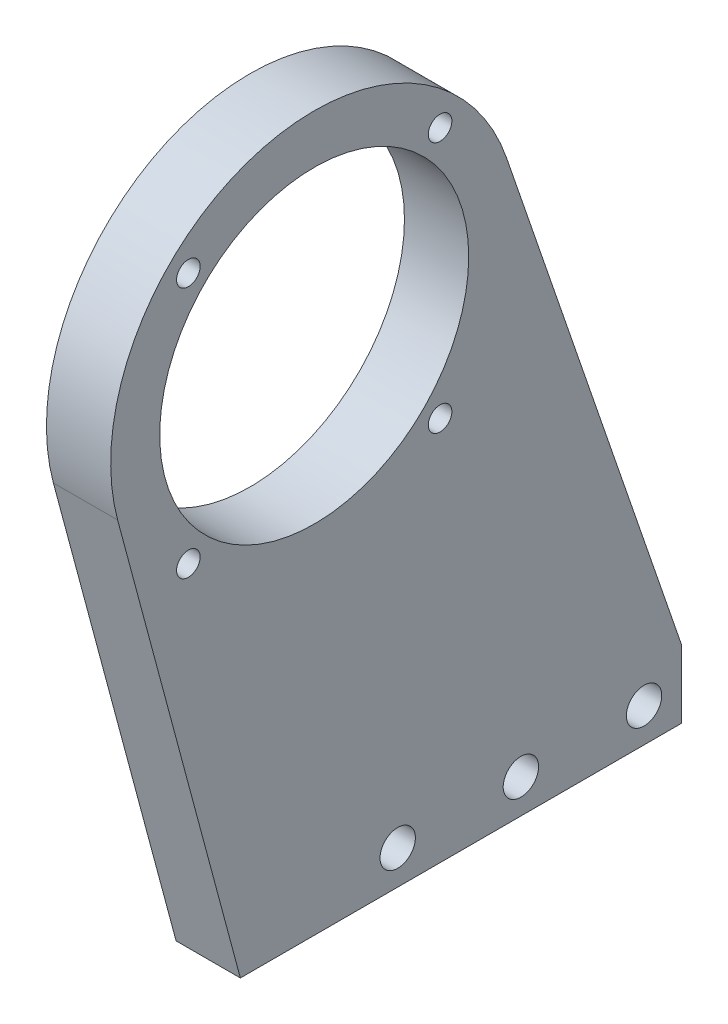
ISO-10303-21;
HEADER;
FILE_DESCRIPTION(('STEP AP214'),'2;1');
FILE_NAME('part.step','',(''),(''),'','','');
FILE_SCHEMA(('AUTOMOTIVE_DESIGN { 1 0 10303 214 1 1 1 1 }'));
ENDSEC;
DATA;
#1=APPLICATION_CONTEXT('core data for automotive mechanical design processes');
#2=APPLICATION_PROTOCOL_DEFINITION('international standard','automotive_design',2000,#1);
#3=PRODUCT_CONTEXT('',#1,'mechanical');
#4=PRODUCT('Part','Part','',(#3));
#5=PRODUCT_RELATED_PRODUCT_CATEGORY('part','',(#4));
#6=PRODUCT_DEFINITION_FORMATION('','',#4);
#7=PRODUCT_DEFINITION_CONTEXT('part definition',#1,'design');
#8=PRODUCT_DEFINITION('design','',#6,#7);
#9=PRODUCT_DEFINITION_SHAPE('','',#8);
#10=(LENGTH_UNIT() NAMED_UNIT(*) SI_UNIT(.MILLI.,.METRE.));
#11=(NAMED_UNIT(*) PLANE_ANGLE_UNIT() SI_UNIT($,.RADIAN.));
#12=(NAMED_UNIT(*) SI_UNIT($,.STERADIAN.) SOLID_ANGLE_UNIT());
#13=UNCERTAINTY_MEASURE_WITH_UNIT(LENGTH_MEASURE(1.E-05),#10,'distance_accuracy_value','');
#14=(GEOMETRIC_REPRESENTATION_CONTEXT(3) GLOBAL_UNCERTAINTY_ASSIGNED_CONTEXT((#13)) GLOBAL_UNIT_ASSIGNED_CONTEXT((#10,
#11,#12)) REPRESENTATION_CONTEXT('',''));
#15=CARTESIAN_POINT('',(0.,0.,0.));
#16=DIRECTION('',(0.,0.,1.));
#17=DIRECTION('',(1.,0.,0.));
#18=AXIS2_PLACEMENT_3D('',#15,#16,#17);
#19=CARTESIAN_POINT('',(12.7,12.3513660545207,-35.9366631253826));
#20=DIRECTION('',(0.,0.325035948803177,-0.945701661194279));
#21=DIRECTION('',(0.,0.945701661194279,0.325035948803177));
#22=AXIS2_PLACEMENT_3D('',#19,#20,#21);
#23=PLANE('',#22);
#24=DIRECTION('',(0.,-0.945701661194279,-0.325035948803178));
#25=VECTOR('',#24,1.);
#26=CARTESIAN_POINT('',(0.,12.3513660545207,-35.9366631253826));
#27=LINE('',#26,#25);
#28=CARTESIAN_POINT('',(0.,12.3513660545207,-35.9366631253826));
#29=VERTEX_POINT('',#28);
#30=CARTESIAN_POINT('',(0.,-82.65,-68.5884606427241));
#31=VERTEX_POINT('',#30);
#32=EDGE_CURVE('E107',#29,#31,#27,.T.);
#33=ORIENTED_EDGE('',*,*,#32,.F.);
#34=DIRECTION('',(-1.,0.,0.));
#35=VECTOR('',#34,1.);
#36=CARTESIAN_POINT('',(12.7,12.3513660545207,-35.9366631253826));
#37=LINE('',#36,#35);
#38=CARTESIAN_POINT('',(12.,12.3513660545207,-35.9366631253826));
#39=VERTEX_POINT('',#38);
#40=EDGE_CURVE('E12',#39,#29,#37,.T.);
#41=ORIENTED_EDGE('',*,*,#40,.F.);
#42=DIRECTION('',(0.,-0.945701661194279,-0.325035948803177));
#43=VECTOR('',#42,1.);
#44=CARTESIAN_POINT('',(12.,12.3513660545207,-35.9366631253826));
#45=LINE('',#44,#43);
#46=CARTESIAN_POINT('',(12.,-82.65,-68.5884606427241));
#47=VERTEX_POINT('',#46);
#48=EDGE_CURVE('E142',#39,#47,#45,.T.);
#49=ORIENTED_EDGE('',*,*,#48,.T.);
#50=DIRECTION('',(-1.,0.,0.));
#51=VECTOR('',#50,1.);
#52=CARTESIAN_POINT('',(12.7,-82.65,-68.5884606427241));
#53=LINE('',#52,#51);
#54=EDGE_CURVE('E63',#47,#31,#53,.T.);
#55=ORIENTED_EDGE('',*,*,#54,.T.);
#56=EDGE_LOOP('',(#33,#41,#49,#55));
#57=FACE_BOUND('',#56,.T.);
#58=ADVANCED_FACE('F44',(#57),#23,.T.);
#59=CARTESIAN_POINT('',(12.7,0.,0.));
#60=DIRECTION('',(-1.,0.,0.));
#61=DIRECTION('',(0.,0.,1.));
#62=AXIS2_PLACEMENT_3D('',#59,#60,#61);
#63=CYLINDRICAL_SURFACE('',#62,38.);
#64=CARTESIAN_POINT('',(0.,0.,0.));
#65=DIRECTION('',(1.,0.,0.));
#66=DIRECTION('',(0.,0.,-1.));
#67=AXIS2_PLACEMENT_3D('',#64,#65,#66);
#68=CIRCLE('',#67,38.);
#69=CARTESIAN_POINT('',(0.,-9.83512371389568,36.7051813989846));
#70=VERTEX_POINT('',#69);
#71=EDGE_CURVE('E100',#29,#70,#68,.T.);
#72=ORIENTED_EDGE('',*,*,#71,.T.);
#73=DIRECTION('',(-1.,0.,0.));
#74=VECTOR('',#73,1.);
#75=CARTESIAN_POINT('',(12.7,-9.83512371389568,36.7051813989846));
#76=LINE('',#75,#74);
#77=CARTESIAN_POINT('',(12.,-9.83512371389568,36.7051813989846));
#78=VERTEX_POINT('',#77);
#79=EDGE_CURVE('E54',#78,#70,#76,.T.);
#80=ORIENTED_EDGE('',*,*,#79,.F.);
#81=CARTESIAN_POINT('',(12.,0.,0.));
#82=DIRECTION('',(1.,0.,0.));
#83=DIRECTION('',(0.,0.,-1.));
#84=AXIS2_PLACEMENT_3D('',#81,#82,#83);
#85=CIRCLE('',#84,38.);
#86=EDGE_CURVE('E78',#39,#78,#85,.T.);
#87=ORIENTED_EDGE('',*,*,#86,.F.);
#88=ORIENTED_EDGE('',*,*,#40,.T.);
#89=EDGE_LOOP('',(#72,#80,#87,#88));
#90=FACE_BOUND('',#89,.T.);
#91=ADVANCED_FACE('F99',(#90),#63,.T.);
#92=CARTESIAN_POINT('',(12.7,-9.8351237138957,36.7051813989846));
#93=DIRECTION('',(0.,0.258819045102518,-0.965925826289069));
#94=DIRECTION('',(0.,0.965925826289069,0.258819045102518));
#95=AXIS2_PLACEMENT_3D('',#92,#93,#94);
#96=PLANE('',#95);
#97=DIRECTION('',(0.,-0.965925826289069,-0.258819045102518));
#98=VECTOR('',#97,1.);
#99=CARTESIAN_POINT('',(0.,-9.8351237138957,36.7051813989846));
#100=LINE('',#99,#98);
#101=CARTESIAN_POINT('',(0.,-95.35,13.7915393572759));
#102=VERTEX_POINT('',#101);
#103=EDGE_CURVE('E109',#70,#102,#100,.T.);
#104=ORIENTED_EDGE('',*,*,#103,.T.);
#105=DIRECTION('',(-1.,0.,0.));
#106=VECTOR('',#105,1.);
#107=CARTESIAN_POINT('',(12.7,-95.35,13.7915393572759));
#108=LINE('',#107,#106);
#109=CARTESIAN_POINT('',(12.,-95.35,13.7915393572759));
#110=VERTEX_POINT('',#109);
#111=EDGE_CURVE('E145',#110,#102,#108,.T.);
#112=ORIENTED_EDGE('',*,*,#111,.F.);
#113=DIRECTION('',(0.,-0.965925826289069,-0.258819045102518));
#114=VECTOR('',#113,1.);
#115=CARTESIAN_POINT('',(12.,-9.8351237138957,36.7051813989846));
#116=LINE('',#115,#114);
#117=EDGE_CURVE('E155',#78,#110,#116,.T.);
#118=ORIENTED_EDGE('',*,*,#117,.F.);
#119=ORIENTED_EDGE('',*,*,#79,.T.);
#120=EDGE_LOOP('',(#104,#112,#118,#119));
#121=FACE_BOUND('',#120,.T.);
#122=ADVANCED_FACE('F197',(#121),#96,.F.);
#123=CARTESIAN_POINT('',(12.7,-95.35,0.));
#124=DIRECTION('',(0.,1.,0.));
#125=DIRECTION('',(0.,0.,1.));
#126=AXIS2_PLACEMENT_3D('',#123,#124,#125);
#127=PLANE('',#126);
#128=DIRECTION('',(0.,0.,-1.));
#129=VECTOR('',#128,1.);
#130=CARTESIAN_POINT('',(0.,-95.35,0.));
#131=LINE('',#130,#129);
#132=CARTESIAN_POINT('',(0.,-95.35,-68.5884606427241));
#133=VERTEX_POINT('',#132);
#134=EDGE_CURVE('E114',#102,#133,#131,.T.);
#135=ORIENTED_EDGE('',*,*,#134,.T.);
#136=DIRECTION('',(-1.,0.,0.));
#137=VECTOR('',#136,1.);
#138=CARTESIAN_POINT('',(12.7,-95.35,-68.5884606427241));
#139=LINE('',#138,#137);
#140=CARTESIAN_POINT('',(12.,-95.35,-68.5884606427241));
#141=VERTEX_POINT('',#140);
#142=EDGE_CURVE('E88',#141,#133,#139,.T.);
#143=ORIENTED_EDGE('',*,*,#142,.F.);
#144=DIRECTION('',(0.,0.,-1.));
#145=VECTOR('',#144,1.);
#146=CARTESIAN_POINT('',(12.,-95.35,0.));
#147=LINE('',#146,#145);
#148=EDGE_CURVE('E153',#110,#141,#147,.T.);
#149=ORIENTED_EDGE('',*,*,#148,.F.);
#150=ORIENTED_EDGE('',*,*,#111,.T.);
#151=EDGE_LOOP('',(#135,#143,#149,#150));
#152=FACE_BOUND('',#151,.T.);
#153=ADVANCED_FACE('F202',(#152),#127,.F.);
#154=CARTESIAN_POINT('',(12.7,-88.9999999999999,-38.59));
#155=DIRECTION('',(-1.,0.,0.));
#156=DIRECTION('',(0.,0.,1.));
#157=AXIS2_PLACEMENT_3D('',#154,#155,#156);
#158=CYLINDRICAL_SURFACE('',#157,3.3);
#159=CARTESIAN_POINT('',(12.,-88.9999999999999,-38.59));
#160=DIRECTION('',(1.,0.,0.));
#161=DIRECTION('',(0.,0.,-1.));
#162=AXIS2_PLACEMENT_3D('',#159,#160,#161);
#163=CIRCLE('',#162,3.3);
#164=CARTESIAN_POINT('',(12.,-88.9999999999999,-41.89));
#165=VERTEX_POINT('',#164);
#166=EDGE_CURVE('E174',#165,#165,#163,.T.);
#167=ORIENTED_EDGE('',*,*,#166,.T.);
#168=EDGE_LOOP('',(#167));
#169=FACE_BOUND('',#168,.T.);
#170=CARTESIAN_POINT('',(0.,-88.9999999999999,-38.59));
#171=DIRECTION('',(1.,0.,0.));
#172=DIRECTION('',(0.,0.,-1.));
#173=AXIS2_PLACEMENT_3D('',#170,#171,#172);
#174=CIRCLE('',#173,3.3);
#175=CARTESIAN_POINT('',(0.,-88.9999999999999,-41.89));
#176=VERTEX_POINT('',#175);
#177=EDGE_CURVE('E136',#176,#176,#174,.T.);
#178=ORIENTED_EDGE('',*,*,#177,.F.);
#179=EDGE_LOOP('',(#178));
#180=FACE_BOUND('',#179,.T.);
#181=ADVANCED_FACE('F206',(#169,#180),#158,.F.);
#182=CARTESIAN_POINT('',(12.7,-88.9999999999999,-15.59));
#183=DIRECTION('',(-1.,0.,0.));
#184=DIRECTION('',(0.,0.,1.));
#185=AXIS2_PLACEMENT_3D('',#182,#183,#184);
#186=CYLINDRICAL_SURFACE('',#185,3.3);
#187=CARTESIAN_POINT('',(12.,-88.9999999999999,-15.59));
#188=DIRECTION('',(1.,0.,0.));
#189=DIRECTION('',(0.,0.,-1.));
#190=AXIS2_PLACEMENT_3D('',#187,#188,#189);
#191=CIRCLE('',#190,3.3);
#192=CARTESIAN_POINT('',(12.,-88.9999999999999,-18.89));
#193=VERTEX_POINT('',#192);
#194=EDGE_CURVE('E172',#193,#193,#191,.T.);
#195=ORIENTED_EDGE('',*,*,#194,.T.);
#196=EDGE_LOOP('',(#195));
#197=FACE_BOUND('',#196,.T.);
#198=CARTESIAN_POINT('',(0.,-88.9999999999999,-15.59));
#199=DIRECTION('',(1.,0.,0.));
#200=DIRECTION('',(0.,0.,-1.));
#201=AXIS2_PLACEMENT_3D('',#198,#199,#200);
#202=CIRCLE('',#201,3.3);
#203=CARTESIAN_POINT('',(0.,-88.9999999999999,-18.89));
#204=VERTEX_POINT('',#203);
#205=EDGE_CURVE('E133',#204,#204,#202,.T.);
#206=ORIENTED_EDGE('',*,*,#205,.F.);
#207=EDGE_LOOP('',(#206));
#208=FACE_BOUND('',#207,.T.);
#209=ADVANCED_FACE('F229',(#197,#208),#186,.F.);
#210=CARTESIAN_POINT('',(12.7,0.,0.));
#211=DIRECTION('',(-1.,0.,0.));
#212=DIRECTION('',(0.,0.,1.));
#213=AXIS2_PLACEMENT_3D('',#210,#211,#212);
#214=CYLINDRICAL_SURFACE('',#213,28.85);
#215=CARTESIAN_POINT('',(12.,0.,0.));
#216=DIRECTION('',(1.,0.,0.));
#217=DIRECTION('',(0.,0.,-1.));
#218=AXIS2_PLACEMENT_3D('',#215,#216,#217);
#219=CIRCLE('',#218,28.85);
#220=CARTESIAN_POINT('',(12.,0.,-28.85));
#221=VERTEX_POINT('',#220);
#222=EDGE_CURVE('E169',#221,#221,#219,.T.);
#223=ORIENTED_EDGE('',*,*,#222,.T.);
#224=EDGE_LOOP('',(#223));
#225=FACE_BOUND('',#224,.T.);
#226=CARTESIAN_POINT('',(0.,0.,0.));
#227=DIRECTION('',(1.,0.,0.));
#228=DIRECTION('',(0.,0.,-1.));
#229=AXIS2_PLACEMENT_3D('',#226,#227,#228);
#230=CIRCLE('',#229,28.85);
#231=CARTESIAN_POINT('',(0.,0.,-28.85));
#232=VERTEX_POINT('',#231);
#233=EDGE_CURVE('E130',#232,#232,#230,.T.);
#234=ORIENTED_EDGE('',*,*,#233,.F.);
#235=EDGE_LOOP('',(#234));
#236=FACE_BOUND('',#235,.T.);
#237=ADVANCED_FACE('F225',(#225,#236),#214,.F.);
#238=CARTESIAN_POINT('',(12.7,23.5,23.5));
#239=DIRECTION('',(-1.,0.,0.));
#240=DIRECTION('',(0.,0.,1.));
#241=AXIS2_PLACEMENT_3D('',#238,#239,#240);
#242=CYLINDRICAL_SURFACE('',#241,2.2);
#243=CARTESIAN_POINT('',(12.,23.5,23.5));
#244=DIRECTION('',(1.,0.,0.));
#245=DIRECTION('',(0.,0.,-1.));
#246=AXIS2_PLACEMENT_3D('',#243,#244,#245);
#247=CIRCLE('',#246,2.2);
#248=CARTESIAN_POINT('',(12.,23.5,21.3));
#249=VERTEX_POINT('',#248);
#250=EDGE_CURVE('E166',#249,#249,#247,.T.);
#251=ORIENTED_EDGE('',*,*,#250,.T.);
#252=EDGE_LOOP('',(#251));
#253=FACE_BOUND('',#252,.T.);
#254=CARTESIAN_POINT('',(0.,23.5,23.5));
#255=DIRECTION('',(1.,0.,0.));
#256=DIRECTION('',(0.,0.,-1.));
#257=AXIS2_PLACEMENT_3D('',#254,#255,#256);
#258=CIRCLE('',#257,2.2);
#259=CARTESIAN_POINT('',(0.,23.5,21.3));
#260=VERTEX_POINT('',#259);
#261=EDGE_CURVE('E127',#260,#260,#258,.T.);
#262=ORIENTED_EDGE('',*,*,#261,.F.);
#263=EDGE_LOOP('',(#262));
#264=FACE_BOUND('',#263,.T.);
#265=ADVANCED_FACE('F221',(#253,#264),#242,.F.);
#266=CARTESIAN_POINT('',(12.7,23.5,-23.5));
#267=DIRECTION('',(-1.,0.,0.));
#268=DIRECTION('',(0.,0.,1.));
#269=AXIS2_PLACEMENT_3D('',#266,#267,#268);
#270=CYLINDRICAL_SURFACE('',#269,2.2);
#271=CARTESIAN_POINT('',(12.,23.5,-23.5));
#272=DIRECTION('',(1.,0.,0.));
#273=DIRECTION('',(0.,0.,-1.));
#274=AXIS2_PLACEMENT_3D('',#271,#272,#273);
#275=CIRCLE('',#274,2.2);
#276=CARTESIAN_POINT('',(12.,23.5,-25.7));
#277=VERTEX_POINT('',#276);
#278=EDGE_CURVE('E163',#277,#277,#275,.T.);
#279=ORIENTED_EDGE('',*,*,#278,.T.);
#280=EDGE_LOOP('',(#279));
#281=FACE_BOUND('',#280,.T.);
#282=CARTESIAN_POINT('',(0.,23.5,-23.5));
#283=DIRECTION('',(1.,0.,0.));
#284=DIRECTION('',(0.,0.,-1.));
#285=AXIS2_PLACEMENT_3D('',#282,#283,#284);
#286=CIRCLE('',#285,2.2);
#287=CARTESIAN_POINT('',(0.,23.5,-25.7));
#288=VERTEX_POINT('',#287);
#289=EDGE_CURVE('E124',#288,#288,#286,.T.);
#290=ORIENTED_EDGE('',*,*,#289,.F.);
#291=EDGE_LOOP('',(#290));
#292=FACE_BOUND('',#291,.T.);
#293=ADVANCED_FACE('F217',(#281,#292),#270,.F.);
#294=CARTESIAN_POINT('',(12.7,-23.5,23.5));
#295=DIRECTION('',(-1.,0.,0.));
#296=DIRECTION('',(0.,0.,1.));
#297=AXIS2_PLACEMENT_3D('',#294,#295,#296);
#298=CYLINDRICAL_SURFACE('',#297,2.2);
#299=CARTESIAN_POINT('',(12.,-23.5,23.5));
#300=DIRECTION('',(1.,0.,0.));
#301=DIRECTION('',(0.,0.,-1.));
#302=AXIS2_PLACEMENT_3D('',#299,#300,#301);
#303=CIRCLE('',#302,2.2);
#304=CARTESIAN_POINT('',(12.,-23.5,21.3));
#305=VERTEX_POINT('',#304);
#306=EDGE_CURVE('E160',#305,#305,#303,.T.);
#307=ORIENTED_EDGE('',*,*,#306,.T.);
#308=EDGE_LOOP('',(#307));
#309=FACE_BOUND('',#308,.T.);
#310=CARTESIAN_POINT('',(0.,-23.5,23.5));
#311=DIRECTION('',(1.,0.,0.));
#312=DIRECTION('',(0.,0.,-1.));
#313=AXIS2_PLACEMENT_3D('',#310,#311,#312);
#314=CIRCLE('',#313,2.2);
#315=CARTESIAN_POINT('',(0.,-23.5,21.3));
#316=VERTEX_POINT('',#315);
#317=EDGE_CURVE('E121',#316,#316,#314,.T.);
#318=ORIENTED_EDGE('',*,*,#317,.F.);
#319=EDGE_LOOP('',(#318));
#320=FACE_BOUND('',#319,.T.);
#321=ADVANCED_FACE('F213',(#309,#320),#298,.F.);
#322=CARTESIAN_POINT('',(12.7,-23.5,-23.5));
#323=DIRECTION('',(-1.,0.,0.));
#324=DIRECTION('',(0.,0.,1.));
#325=AXIS2_PLACEMENT_3D('',#322,#323,#324);
#326=CYLINDRICAL_SURFACE('',#325,2.2);
#327=CARTESIAN_POINT('',(12.,-23.5,-23.5));
#328=DIRECTION('',(1.,0.,0.));
#329=DIRECTION('',(0.,0.,-1.));
#330=AXIS2_PLACEMENT_3D('',#327,#328,#329);
#331=CIRCLE('',#330,2.2);
#332=CARTESIAN_POINT('',(12.,-23.5,-25.7));
#333=VERTEX_POINT('',#332);
#334=EDGE_CURVE('E152',#333,#333,#331,.T.);
#335=ORIENTED_EDGE('',*,*,#334,.T.);
#336=EDGE_LOOP('',(#335));
#337=FACE_BOUND('',#336,.T.);
#338=CARTESIAN_POINT('',(0.,-23.5,-23.5));
#339=DIRECTION('',(1.,0.,0.));
#340=DIRECTION('',(0.,0.,-1.));
#341=AXIS2_PLACEMENT_3D('',#338,#339,#340);
#342=CIRCLE('',#341,2.2);
#343=CARTESIAN_POINT('',(0.,-23.5,-25.7));
#344=VERTEX_POINT('',#343);
#345=EDGE_CURVE('E118',#344,#344,#342,.T.);
#346=ORIENTED_EDGE('',*,*,#345,.F.);
#347=EDGE_LOOP('',(#346));
#348=FACE_BOUND('',#347,.T.);
#349=ADVANCED_FACE('F210',(#337,#348),#326,.F.);
#350=CARTESIAN_POINT('',(12.7,0.,-68.5884606427241));
#351=DIRECTION('',(0.,0.,-1.));
#352=DIRECTION('',(-1.,0.,0.));
#353=AXIS2_PLACEMENT_3D('',#350,#351,#352);
#354=PLANE('',#353);
#355=DIRECTION('',(0.,-1.,0.));
#356=VECTOR('',#355,1.);
#357=CARTESIAN_POINT('',(0.,0.,-68.5884606427241));
#358=LINE('',#357,#356);
#359=EDGE_CURVE('E116',#31,#133,#358,.T.);
#360=ORIENTED_EDGE('',*,*,#359,.F.);
#361=ORIENTED_EDGE('',*,*,#54,.F.);
#362=DIRECTION('',(0.,-1.,0.));
#363=VECTOR('',#362,1.);
#364=CARTESIAN_POINT('',(12.,0.,-68.5884606427241));
#365=LINE('',#364,#363);
#366=EDGE_CURVE('E150',#47,#141,#365,.T.);
#367=ORIENTED_EDGE('',*,*,#366,.T.);
#368=ORIENTED_EDGE('',*,*,#142,.T.);
#369=EDGE_LOOP('',(#360,#361,#367,#368));
#370=FACE_BOUND('',#369,.T.);
#371=ADVANCED_FACE('F190',(#370),#354,.T.);
#372=CARTESIAN_POINT('',(12.7,-88.9999999999999,-61.59));
#373=DIRECTION('',(-1.,0.,0.));
#374=DIRECTION('',(0.,0.,1.));
#375=AXIS2_PLACEMENT_3D('',#372,#373,#374);
#376=CYLINDRICAL_SURFACE('',#375,3.3);
#377=CARTESIAN_POINT('',(12.,-88.9999999999999,-61.59));
#378=DIRECTION('',(1.,0.,0.));
#379=DIRECTION('',(0.,0.,-1.));
#380=AXIS2_PLACEMENT_3D('',#377,#378,#379);
#381=CIRCLE('',#380,3.3);
#382=CARTESIAN_POINT('',(12.,-88.9999999999999,-64.89));
#383=VERTEX_POINT('',#382);
#384=EDGE_CURVE('E48',#383,#383,#381,.T.);
#385=ORIENTED_EDGE('',*,*,#384,.T.);
#386=EDGE_LOOP('',(#385));
#387=FACE_BOUND('',#386,.T.);
#388=CARTESIAN_POINT('',(0.,-88.9999999999999,-61.59));
#389=DIRECTION('',(1.,0.,0.));
#390=DIRECTION('',(0.,0.,-1.));
#391=AXIS2_PLACEMENT_3D('',#388,#389,#390);
#392=CIRCLE('',#391,3.3);
#393=CARTESIAN_POINT('',(0.,-88.9999999999999,-64.89));
#394=VERTEX_POINT('',#393);
#395=EDGE_CURVE('E139',#394,#394,#392,.T.);
#396=ORIENTED_EDGE('',*,*,#395,.F.);
#397=EDGE_LOOP('',(#396));
#398=FACE_BOUND('',#397,.T.);
#399=ADVANCED_FACE('F181',(#387,#398),#376,.F.);
#400=CARTESIAN_POINT('',(12.,0.,0.));
#401=DIRECTION('',(1.,0.,0.));
#402=DIRECTION('',(0.,0.,-1.));
#403=AXIS2_PLACEMENT_3D('',#400,#401,#402);
#404=PLANE('',#403);
#405=ORIENTED_EDGE('',*,*,#48,.F.);
#406=ORIENTED_EDGE('',*,*,#86,.T.);
#407=ORIENTED_EDGE('',*,*,#117,.T.);
#408=ORIENTED_EDGE('',*,*,#148,.T.);
#409=ORIENTED_EDGE('',*,*,#366,.F.);
#410=EDGE_LOOP('',(#405,#406,#407,#408,#409));
#411=FACE_BOUND('',#410,.T.);
#412=ORIENTED_EDGE('',*,*,#334,.F.);
#413=EDGE_LOOP('',(#412));
#414=FACE_BOUND('',#413,.T.);
#415=ORIENTED_EDGE('',*,*,#306,.F.);
#416=EDGE_LOOP('',(#415));
#417=FACE_BOUND('',#416,.T.);
#418=ORIENTED_EDGE('',*,*,#278,.F.);
#419=EDGE_LOOP('',(#418));
#420=FACE_BOUND('',#419,.T.);
#421=ORIENTED_EDGE('',*,*,#250,.F.);
#422=EDGE_LOOP('',(#421));
#423=FACE_BOUND('',#422,.T.);
#424=ORIENTED_EDGE('',*,*,#222,.F.);
#425=EDGE_LOOP('',(#424));
#426=FACE_BOUND('',#425,.T.);
#427=ORIENTED_EDGE('',*,*,#194,.F.);
#428=EDGE_LOOP('',(#427));
#429=FACE_BOUND('',#428,.T.);
#430=ORIENTED_EDGE('',*,*,#166,.F.);
#431=EDGE_LOOP('',(#430));
#432=FACE_BOUND('',#431,.T.);
#433=ORIENTED_EDGE('',*,*,#384,.F.);
#434=EDGE_LOOP('',(#433));
#435=FACE_BOUND('',#434,.T.);
#436=ADVANCED_FACE('F46',(#411,#414,#417,#420,#423,#426,#429,#432,#435),#404,.T.);
#437=CARTESIAN_POINT('',(0.,0.,0.));
#438=DIRECTION('',(1.,0.,0.));
#439=DIRECTION('',(0.,0.,-1.));
#440=AXIS2_PLACEMENT_3D('',#437,#438,#439);
#441=PLANE('',#440);
#442=ORIENTED_EDGE('',*,*,#32,.T.);
#443=ORIENTED_EDGE('',*,*,#359,.T.);
#444=ORIENTED_EDGE('',*,*,#134,.F.);
#445=ORIENTED_EDGE('',*,*,#103,.F.);
#446=ORIENTED_EDGE('',*,*,#71,.F.);
#447=EDGE_LOOP('',(#442,#443,#444,#445,#446));
#448=FACE_BOUND('',#447,.T.);
#449=ORIENTED_EDGE('',*,*,#345,.T.);
#450=EDGE_LOOP('',(#449));
#451=FACE_BOUND('',#450,.T.);
#452=ORIENTED_EDGE('',*,*,#317,.T.);
#453=EDGE_LOOP('',(#452));
#454=FACE_BOUND('',#453,.T.);
#455=ORIENTED_EDGE('',*,*,#289,.T.);
#456=EDGE_LOOP('',(#455));
#457=FACE_BOUND('',#456,.T.);
#458=ORIENTED_EDGE('',*,*,#261,.T.);
#459=EDGE_LOOP('',(#458));
#460=FACE_BOUND('',#459,.T.);
#461=ORIENTED_EDGE('',*,*,#233,.T.);
#462=EDGE_LOOP('',(#461));
#463=FACE_BOUND('',#462,.T.);
#464=ORIENTED_EDGE('',*,*,#205,.T.);
#465=EDGE_LOOP('',(#464));
#466=FACE_BOUND('',#465,.T.);
#467=ORIENTED_EDGE('',*,*,#177,.T.);
#468=EDGE_LOOP('',(#467));
#469=FACE_BOUND('',#468,.T.);
#470=ORIENTED_EDGE('',*,*,#395,.T.);
#471=EDGE_LOOP('',(#470));
#472=FACE_BOUND('',#471,.T.);
#473=ADVANCED_FACE('F104',(#448,#451,#454,#457,#460,#463,#466,#469,#472),#441,.F.);
#474=CLOSED_SHELL('',(#58,#91,#122,#153,#181,#209,#237,#265,#293,#321,#349,#371,#399,#436,#473));
#475=MANIFOLD_SOLID_BREP('B2',#474);
#476=ADVANCED_BREP_SHAPE_REPRESENTATION('',(#18,#475),#14);
#477=SHAPE_DEFINITION_REPRESENTATION(#9,#476);
ENDSEC;
END-ISO-10303-21;
